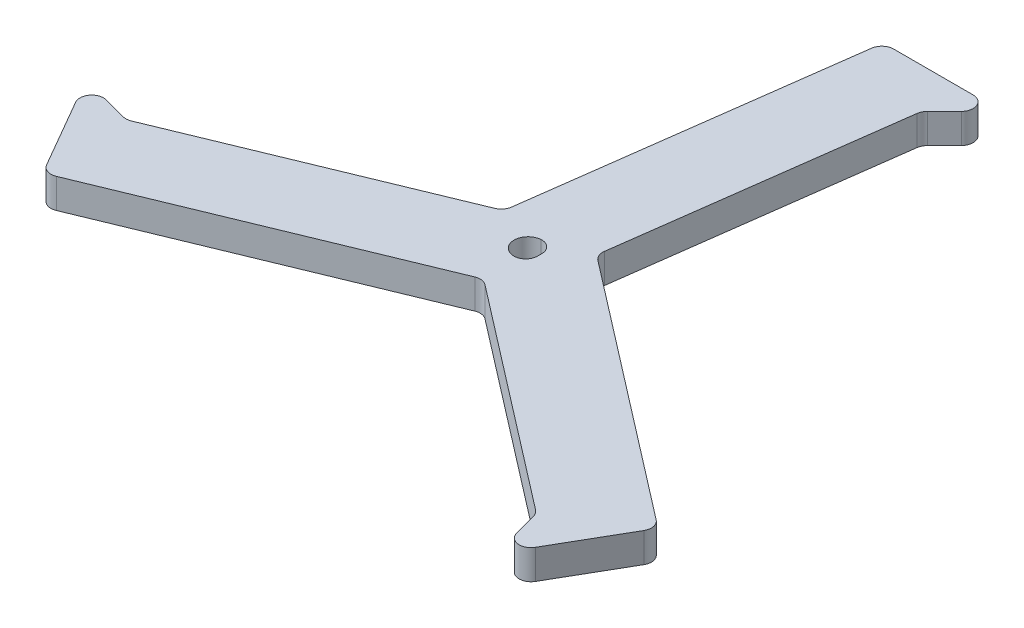
ISO-10303-21;
HEADER;
FILE_DESCRIPTION(('STEP AP214'),'2;1');
FILE_NAME('part.step','',(''),(''),'','','');
FILE_SCHEMA(('AUTOMOTIVE_DESIGN { 1 0 10303 214 1 1 1 1 }'));
ENDSEC;
DATA;
#1=APPLICATION_CONTEXT('core data for automotive mechanical design processes');
#2=APPLICATION_PROTOCOL_DEFINITION('international standard','automotive_design',2000,#1);
#3=PRODUCT_CONTEXT('',#1,'mechanical');
#4=PRODUCT('Part','Part','',(#3));
#5=PRODUCT_RELATED_PRODUCT_CATEGORY('part','',(#4));
#6=PRODUCT_DEFINITION_FORMATION('','',#4);
#7=PRODUCT_DEFINITION_CONTEXT('part definition',#1,'design');
#8=PRODUCT_DEFINITION('design','',#6,#7);
#9=PRODUCT_DEFINITION_SHAPE('','',#8);
#10=(LENGTH_UNIT() NAMED_UNIT(*) SI_UNIT(.MILLI.,.METRE.));
#11=(NAMED_UNIT(*) PLANE_ANGLE_UNIT() SI_UNIT($,.RADIAN.));
#12=(NAMED_UNIT(*) SI_UNIT($,.STERADIAN.) SOLID_ANGLE_UNIT());
#13=UNCERTAINTY_MEASURE_WITH_UNIT(LENGTH_MEASURE(1.E-05),#10,'distance_accuracy_value','');
#14=(GEOMETRIC_REPRESENTATION_CONTEXT(3) GLOBAL_UNCERTAINTY_ASSIGNED_CONTEXT((#13)) GLOBAL_UNIT_ASSIGNED_CONTEXT((#10,
#11,#12)) REPRESENTATION_CONTEXT('',''));
#15=CARTESIAN_POINT('',(0.,0.,0.));
#16=DIRECTION('',(0.,0.,1.));
#17=DIRECTION('',(1.,0.,0.));
#18=AXIS2_PLACEMENT_3D('',#15,#16,#17);
#19=CARTESIAN_POINT('',(3.84359543341386,6.35,9.32960669215885));
#20=DIRECTION('',(0.380918653468894,0.,0.924608554708123));
#21=DIRECTION('',(0.924608554708123,0.,-0.380918653468894));
#22=AXIS2_PLACEMENT_3D('',#19,#20,#21);
#23=PLANE('',#22);
#24=DIRECTION('',(-0.924608554708123,0.,0.380918653468894));
#25=VECTOR('',#24,1.);
#26=CARTESIAN_POINT('',(3.84359543341386,6.35,9.32960669215885));
#27=LINE('',#26,#25);
#28=CARTESIAN_POINT('',(-0.359568594695665,6.35,11.0612190309629));
#29=VERTEX_POINT('',#28);
#30=CARTESIAN_POINT('',(-63.9355147681547,6.35,37.2531287705929));
#31=VERTEX_POINT('',#30);
#32=EDGE_CURVE('E397',#29,#31,#27,.T.);
#33=ORIENTED_EDGE('',*,*,#32,.T.);
#34=DIRECTION('',(0.,-1.,0.));
#35=VECTOR('',#34,1.);
#36=CARTESIAN_POINT('',(-63.9355147681547,6.35,37.2531287705929));
#37=LINE('',#36,#35);
#38=CARTESIAN_POINT('',(-63.9355147681547,0.,37.2531287705929));
#39=VERTEX_POINT('',#38);
#40=EDGE_CURVE('E246',#31,#39,#37,.T.);
#41=ORIENTED_EDGE('',*,*,#40,.T.);
#42=DIRECTION('',(-0.924608554708123,0.,0.380918653468894));
#43=VECTOR('',#42,1.);
#44=CARTESIAN_POINT('',(3.84359543341386,0.,9.32960669215885));
#45=LINE('',#44,#43);
#46=CARTESIAN_POINT('',(-0.359568594695665,0.,11.0612190309629));
#47=VERTEX_POINT('',#46);
#48=EDGE_CURVE('E230',#47,#39,#45,.T.);
#49=ORIENTED_EDGE('',*,*,#48,.F.);
#50=DIRECTION('',(0.,-1.,0.));
#51=VECTOR('',#50,1.);
#52=CARTESIAN_POINT('',(-0.359568594695664,6.35,11.0612190309629));
#53=LINE('',#52,#51);
#54=EDGE_CURVE('E243',#47,#29,#53,.F.);
#55=ORIENTED_EDGE('',*,*,#54,.T.);
#56=EDGE_LOOP('',(#33,#41,#49,#55));
#57=FACE_BOUND('',#56,.T.);
#58=ADVANCED_FACE('F41',(#57),#23,.T.);
#59=CARTESIAN_POINT('',(-4.70645276048368,6.35,6.10937930785126));
#60=DIRECTION('',(-0.610275170199201,0.,0.792189508033485));
#61=DIRECTION('',(0.792189508033486,0.,0.610275170199201));
#62=AXIS2_PLACEMENT_3D('',#59,#60,#61);
#63=PLANE('',#62);
#64=DIRECTION('',(-0.792189508033486,0.,-0.610275170199201));
#65=VECTOR('',#64,1.);
#66=CARTESIAN_POINT('',(-4.70645276048368,0.,6.10937930785126));
#67=LINE('',#66,#65);
#68=CARTESIAN_POINT('',(49.4673189823005,0.,47.8429638042301));
#69=VERTEX_POINT('',#68);
#70=CARTESIAN_POINT('',(2.1580637174213,0.,11.3975634095165));
#71=VERTEX_POINT('',#70);
#72=EDGE_CURVE('E232',#69,#71,#67,.T.);
#73=ORIENTED_EDGE('',*,*,#72,.F.);
#74=DIRECTION('',(0.,-1.,0.));
#75=VECTOR('',#74,1.);
#76=CARTESIAN_POINT('',(49.4673189823005,6.35,47.8429638042301));
#77=LINE('',#76,#75);
#78=CARTESIAN_POINT('',(49.4673189823005,6.35,47.8429638042301));
#79=VERTEX_POINT('',#78);
#80=EDGE_CURVE('E336',#69,#79,#77,.F.);
#81=ORIENTED_EDGE('',*,*,#80,.T.);
#82=DIRECTION('',(-0.792189508033486,0.,-0.610275170199201));
#83=VECTOR('',#82,1.);
#84=CARTESIAN_POINT('',(-4.70645276048368,6.35,6.10937930785126));
#85=LINE('',#84,#83);
#86=CARTESIAN_POINT('',(2.1580637174213,6.35,11.3975634095165));
#87=VERTEX_POINT('',#86);
#88=EDGE_CURVE('E399',#79,#87,#85,.T.);
#89=ORIENTED_EDGE('',*,*,#88,.T.);
#90=DIRECTION('',(0.,-1.,0.));
#91=VECTOR('',#90,1.);
#92=CARTESIAN_POINT('',(2.1580637174213,0.,11.3975634095165));
#93=LINE('',#92,#91);
#94=EDGE_CURVE('E334',#87,#71,#93,.T.);
#95=ORIENTED_EDGE('',*,*,#94,.T.);
#96=EDGE_LOOP('',(#73,#81,#89,#95));
#97=FACE_BOUND('',#96,.T.);
#98=ADVANCED_FACE('F475',(#97),#63,.T.);
#99=CARTESIAN_POINT('',(34.6970452561253,6.35,-9.29704525612464));
#100=DIRECTION('',(-0.96592582628907,0.,0.258819045102514));
#101=DIRECTION('',(0.258819045102514,0.,0.96592582628907));
#102=AXIS2_PLACEMENT_3D('',#99,#100,#101);
#103=PLANE('',#102);
#104=DIRECTION('',(-0.258819045102514,0.,-0.96592582628907));
#105=VECTOR('',#104,1.);
#106=CARTESIAN_POINT('',(34.6970452561253,0.,-9.29704525612464));
#107=LINE('',#106,#105);
#108=CARTESIAN_POINT('',(51.7040308682014,0.,54.173889131738));
#109=VERTEX_POINT('',#108);
#110=CARTESIAN_POINT('',(50.3706716487687,0.,49.1977247800748));
#111=VERTEX_POINT('',#110);
#112=EDGE_CURVE('E432',#109,#111,#107,.T.);
#113=ORIENTED_EDGE('',*,*,#112,.F.);
#114=DIRECTION('',(0.,-1.,0.));
#115=VECTOR('',#114,1.);
#116=CARTESIAN_POINT('',(51.7040308682014,6.35,54.173889131738));
#117=LINE('',#116,#115);
#118=CARTESIAN_POINT('',(51.7040308682014,6.35,54.173889131738));
#119=VERTEX_POINT('',#118);
#120=EDGE_CURVE('E332',#109,#119,#117,.F.);
#121=ORIENTED_EDGE('',*,*,#120,.T.);
#122=DIRECTION('',(-0.258819045102514,0.,-0.96592582628907));
#123=VECTOR('',#122,1.);
#124=CARTESIAN_POINT('',(34.6970452561253,6.35,-9.29704525612464));
#125=LINE('',#124,#123);
#126=CARTESIAN_POINT('',(50.3706716487687,6.35,49.1977247800748));
#127=VERTEX_POINT('',#126);
#128=EDGE_CURVE('E405',#119,#127,#125,.T.);
#129=ORIENTED_EDGE('',*,*,#128,.T.);
#130=DIRECTION('',(0.,-1.,0.));
#131=VECTOR('',#130,1.);
#132=CARTESIAN_POINT('',(50.3706716487687,0.,49.1977247800748));
#133=LINE('',#132,#131);
#134=EDGE_CURVE('E329',#127,#111,#133,.T.);
#135=ORIENTED_EDGE('',*,*,#134,.T.);
#136=EDGE_LOOP('',(#113,#121,#129,#135));
#137=FACE_BOUND('',#136,.T.);
#138=ADVANCED_FACE('F480',(#137),#103,.T.);
#139=CARTESIAN_POINT('',(65.9911357683743,6.35,38.1));
#140=DIRECTION('',(0.866025403784439,0.,0.499999999999999));
#141=DIRECTION('',(0.499999999999999,0.,-0.866025403784439));
#142=AXIS2_PLACEMENT_3D('',#139,#140,#141);
#143=PLANE('',#142);
#144=DIRECTION('',(-0.499999999999999,0.,0.866025403784439));
#145=VECTOR('',#144,1.);
#146=CARTESIAN_POINT('',(65.9911357683743,0.,38.1));
#147=LINE('',#146,#145);
#148=CARTESIAN_POINT('',(64.8795188631703,0.,40.0253769583657));
#149=VERTEX_POINT('',#148);
#150=CARTESIAN_POINT('',(56.3571869925881,0.,54.7864887571776));
#151=VERTEX_POINT('',#150);
#152=EDGE_CURVE('E435',#149,#151,#147,.T.);
#153=ORIENTED_EDGE('',*,*,#152,.F.);
#154=DIRECTION('',(0.,-1.,0.));
#155=VECTOR('',#154,1.);
#156=CARTESIAN_POINT('',(64.8795188631703,6.35,40.0253769583657));
#157=LINE('',#156,#155);
#158=CARTESIAN_POINT('',(64.8795188631703,6.35,40.0253769583657));
#159=VERTEX_POINT('',#158);
#160=EDGE_CURVE('E327',#149,#159,#157,.F.);
#161=ORIENTED_EDGE('',*,*,#160,.T.);
#162=DIRECTION('',(-0.499999999999999,0.,0.866025403784439));
#163=VECTOR('',#162,1.);
#164=CARTESIAN_POINT('',(65.9911357683743,6.35,38.1));
#165=LINE('',#164,#163);
#166=CARTESIAN_POINT('',(56.3571869925881,6.35,54.7864887571776));
#167=VERTEX_POINT('',#166);
#168=EDGE_CURVE('E408',#159,#167,#165,.T.);
#169=ORIENTED_EDGE('',*,*,#168,.T.);
#170=DIRECTION('',(0.,-1.,0.));
#171=VECTOR('',#170,1.);
#172=CARTESIAN_POINT('',(56.3571869925881,6.35,54.7864887571776));
#173=LINE('',#172,#171);
#174=EDGE_CURVE('E324',#167,#151,#173,.T.);
#175=ORIENTED_EDGE('',*,*,#174,.T.);
#176=EDGE_LOOP('',(#153,#161,#169,#175));
#177=FACE_BOUND('',#176,.T.);
#178=ADVANCED_FACE('F693',(#177),#143,.T.);
#179=CARTESIAN_POINT('',(6.15787868601994,6.35,-7.99345463328569));
#180=DIRECTION('',(0.610275170199202,0.,-0.792189508033485));
#181=DIRECTION('',(-0.792189508033486,0.,-0.610275170199202));
#182=AXIS2_PLACEMENT_3D('',#179,#180,#181);
#183=PLANE('',#182);
#184=DIRECTION('',(0.792189508033485,0.,0.610275170199202));
#185=VECTOR('',#184,1.);
#186=CARTESIAN_POINT('',(6.15787868601994,0.,-7.99345463328569));
#187=LINE('',#186,#185);
#188=CARTESIAN_POINT('',(9.7590809749856,0.,-5.21921397807195));
#189=VERTEX_POINT('',#188);
#190=CARTESIAN_POINT('',(64.2299132698638,0.,36.7432156079607));
#191=VERTEX_POINT('',#190);
#192=EDGE_CURVE('E438',#189,#191,#187,.T.);
#193=ORIENTED_EDGE('',*,*,#192,.F.);
#194=DIRECTION('',(0.,-1.,0.));
#195=VECTOR('',#194,1.);
#196=CARTESIAN_POINT('',(9.7590809749856,6.35,-5.21921397807195));
#197=LINE('',#196,#195);
#198=CARTESIAN_POINT('',(9.7590809749856,6.35,-5.21921397807195));
#199=VERTEX_POINT('',#198);
#200=EDGE_CURVE('E322',#189,#199,#197,.F.);
#201=ORIENTED_EDGE('',*,*,#200,.T.);
#202=DIRECTION('',(0.792189508033485,0.,0.610275170199202));
#203=VECTOR('',#202,1.);
#204=CARTESIAN_POINT('',(6.15787868601994,6.35,-7.99345463328569));
#205=LINE('',#204,#203);
#206=CARTESIAN_POINT('',(64.2299132698638,6.35,36.7432156079607));
#207=VERTEX_POINT('',#206);
#208=EDGE_CURVE('E411',#199,#207,#205,.T.);
#209=ORIENTED_EDGE('',*,*,#208,.T.);
#210=DIRECTION('',(0.,-1.,0.));
#211=VECTOR('',#210,1.);
#212=CARTESIAN_POINT('',(64.2299132698638,6.35,36.7432156079607));
#213=LINE('',#212,#211);
#214=EDGE_CURVE('E319',#207,#191,#213,.T.);
#215=ORIENTED_EDGE('',*,*,#214,.T.);
#216=EDGE_LOOP('',(#193,#201,#209,#215));
#217=FACE_BOUND('',#216,.T.);
#218=ADVANCED_FACE('F684',(#217),#183,.T.);
#219=CARTESIAN_POINT('',(7.644104062196,6.35,1.02121799836464));
#220=DIRECTION('',(0.991193823668096,0.,0.132419046674638));
#221=DIRECTION('',(0.132419046674638,0.,-0.991193823668096));
#222=AXIS2_PLACEMENT_3D('',#219,#220,#221);
#223=PLANE('',#222);
#224=DIRECTION('',(-0.132419046674638,0.,0.991193823668096));
#225=VECTOR('',#224,1.);
#226=CARTESIAN_POINT('',(7.644104062196,0.,1.02121799836464));
#227=LINE('',#226,#225);
#228=CARTESIAN_POINT('',(16.6995625556525,0.,-66.7614367978954));
#229=VERTEX_POINT('',#228);
#230=CARTESIAN_POINT('',(8.7915475951746,0.,-7.56771970703058));
#231=VERTEX_POINT('',#230);
#232=EDGE_CURVE('E441',#229,#231,#227,.T.);
#233=ORIENTED_EDGE('',*,*,#232,.F.);
#234=DIRECTION('',(0.,-1.,0.));
#235=VECTOR('',#234,1.);
#236=CARTESIAN_POINT('',(16.6995625556525,6.35,-66.7614367978954));
#237=LINE('',#236,#235);
#238=CARTESIAN_POINT('',(16.6995625556525,6.35,-66.7614367978954));
#239=VERTEX_POINT('',#238);
#240=EDGE_CURVE('E317',#229,#239,#237,.F.);
#241=ORIENTED_EDGE('',*,*,#240,.T.);
#242=DIRECTION('',(-0.132419046674638,0.,0.991193823668096));
#243=VECTOR('',#242,1.);
#244=CARTESIAN_POINT('',(7.644104062196,6.35,1.02121799836464));
#245=LINE('',#244,#243);
#246=CARTESIAN_POINT('',(8.7915475951746,6.35,-7.56771970703058));
#247=VERTEX_POINT('',#246);
#248=EDGE_CURVE('E414',#239,#247,#245,.T.);
#249=ORIENTED_EDGE('',*,*,#248,.T.);
#250=DIRECTION('',(0.,-1.,0.));
#251=VECTOR('',#250,1.);
#252=CARTESIAN_POINT('',(8.7915475951746,0.,-7.56771970703058));
#253=LINE('',#252,#251);
#254=EDGE_CURVE('E314',#247,#231,#253,.T.);
#255=ORIENTED_EDGE('',*,*,#254,.T.);
#256=EDGE_LOOP('',(#233,#241,#249,#255));
#257=FACE_BOUND('',#256,.T.);
#258=ADVANCED_FACE('F675',(#257),#223,.T.);
#259=CARTESIAN_POINT('',(-25.4000000000001,6.35,-25.4000000000004));
#260=DIRECTION('',(0.707106781186544,0.,0.707106781186551));
#261=DIRECTION('',(0.707106781186551,0.,-0.707106781186544));
#262=AXIS2_PLACEMENT_3D('',#259,#260,#261);
#263=PLANE('',#262);
#264=DIRECTION('',(-0.707106781186551,0.,0.707106781186544));
#265=VECTOR('',#264,1.);
#266=CARTESIAN_POINT('',(-25.4000000000001,0.,-25.4000000000004));
#267=LINE('',#266,#265);
#268=CARTESIAN_POINT('',(21.0639487757861,0.,-71.8639487757862));
#269=VERTEX_POINT('',#268);
#270=CARTESIAN_POINT('',(17.4211436435556,0.,-68.2211436435557));
#271=VERTEX_POINT('',#270);
#272=EDGE_CURVE('E444',#269,#271,#267,.T.);
#273=ORIENTED_EDGE('',*,*,#272,.F.);
#274=DIRECTION('',(0.,-1.,0.));
#275=VECTOR('',#274,1.);
#276=CARTESIAN_POINT('',(21.0639487757861,6.35,-71.8639487757862));
#277=LINE('',#276,#275);
#278=CARTESIAN_POINT('',(21.0639487757861,6.35,-71.8639487757862));
#279=VERTEX_POINT('',#278);
#280=EDGE_CURVE('E312',#269,#279,#277,.F.);
#281=ORIENTED_EDGE('',*,*,#280,.T.);
#282=DIRECTION('',(-0.707106781186551,0.,0.707106781186544));
#283=VECTOR('',#282,1.);
#284=CARTESIAN_POINT('',(-25.4000000000001,6.35,-25.4000000000004));
#285=LINE('',#284,#283);
#286=CARTESIAN_POINT('',(17.4211436435556,6.35,-68.2211436435557));
#287=VERTEX_POINT('',#286);
#288=EDGE_CURVE('E417',#279,#287,#285,.T.);
#289=ORIENTED_EDGE('',*,*,#288,.T.);
#290=DIRECTION('',(0.,-1.,0.));
#291=VECTOR('',#290,1.);
#292=CARTESIAN_POINT('',(17.4211436435556,0.,-68.2211436435557));
#293=LINE('',#292,#291);
#294=EDGE_CURVE('E309',#287,#271,#293,.T.);
#295=ORIENTED_EDGE('',*,*,#294,.T.);
#296=EDGE_LOOP('',(#273,#281,#289,#295));
#297=FACE_BOUND('',#296,.T.);
#298=ADVANCED_FACE('F666',(#297),#263,.T.);
#299=CARTESIAN_POINT('',(0.,6.35,-76.2));
#300=DIRECTION('',(0.,0.,-1.));
#301=DIRECTION('',(-1.,0.,0.));
#302=AXIS2_PLACEMENT_3D('',#299,#300,#301);
#303=PLANE('',#302);
#304=DIRECTION('',(1.,0.,0.));
#305=VECTOR('',#304,1.);
#306=CARTESIAN_POINT('',(0.,0.,-76.2));
#307=LINE('',#306,#305);
#308=CARTESIAN_POINT('',(2.22323381040792,0.,-76.2));
#309=VERTEX_POINT('',#308);
#310=CARTESIAN_POINT('',(19.2678975515723,0.,-76.2));
#311=VERTEX_POINT('',#310);
#312=EDGE_CURVE('E447',#309,#311,#307,.T.);
#313=ORIENTED_EDGE('',*,*,#312,.F.);
#314=DIRECTION('',(0.,-1.,0.));
#315=VECTOR('',#314,1.);
#316=CARTESIAN_POINT('',(2.22323381040792,6.35,-76.2));
#317=LINE('',#316,#315);
#318=CARTESIAN_POINT('',(2.22323381040792,6.35,-76.2));
#319=VERTEX_POINT('',#318);
#320=EDGE_CURVE('E307',#309,#319,#317,.F.);
#321=ORIENTED_EDGE('',*,*,#320,.T.);
#322=DIRECTION('',(1.,0.,0.));
#323=VECTOR('',#322,1.);
#324=CARTESIAN_POINT('',(0.,6.35,-76.2));
#325=LINE('',#324,#323);
#326=CARTESIAN_POINT('',(19.2678975515723,6.35,-76.2));
#327=VERTEX_POINT('',#326);
#328=EDGE_CURVE('E420',#319,#327,#325,.T.);
#329=ORIENTED_EDGE('',*,*,#328,.T.);
#330=DIRECTION('',(0.,-1.,0.));
#331=VECTOR('',#330,1.);
#332=CARTESIAN_POINT('',(19.2678975515723,6.35,-76.2));
#333=LINE('',#332,#331);
#334=EDGE_CURVE('E304',#327,#311,#333,.T.);
#335=ORIENTED_EDGE('',*,*,#334,.T.);
#336=EDGE_LOOP('',(#313,#321,#329,#335));
#337=FACE_BOUND('',#336,.T.);
#338=ADVANCED_FACE('F657',(#337),#303,.T.);
#339=CARTESIAN_POINT('',(-10.0014741194338,6.35,-1.33615205887316));
#340=DIRECTION('',(-0.991193823668096,0.,-0.132419046674638));
#341=DIRECTION('',(-0.132419046674638,0.,0.991193823668096));
#342=AXIS2_PLACEMENT_3D('',#339,#340,#341);
#343=PLANE('',#342);
#344=DIRECTION('',(0.132419046674638,0.,-0.991193823668096));
#345=VECTOR('',#344,1.);
#346=CARTESIAN_POINT('',(-10.0014741194338,0.,-1.33615205887316));
#347=LINE('',#346,#345);
#348=CARTESIAN_POINT('',(-9.39951238028993,0.,-5.84200505289098));
#349=VERTEX_POINT('',#348);
#350=CARTESIAN_POINT('',(-0.294398501709038,0.,-73.9963443785536));
#351=VERTEX_POINT('',#350);
#352=EDGE_CURVE('E450',#349,#351,#347,.T.);
#353=ORIENTED_EDGE('',*,*,#352,.F.);
#354=DIRECTION('',(0.,-1.,0.));
#355=VECTOR('',#354,1.);
#356=CARTESIAN_POINT('',(-9.39951238028993,6.35,-5.84200505289098));
#357=LINE('',#356,#355);
#358=CARTESIAN_POINT('',(-9.39951238028993,6.35,-5.84200505289098));
#359=VERTEX_POINT('',#358);
#360=EDGE_CURVE('E302',#349,#359,#357,.F.);
#361=ORIENTED_EDGE('',*,*,#360,.T.);
#362=DIRECTION('',(0.132419046674638,0.,-0.991193823668096));
#363=VECTOR('',#362,1.);
#364=CARTESIAN_POINT('',(-10.0014741194338,6.35,-1.33615205887316));
#365=LINE('',#364,#363);
#366=CARTESIAN_POINT('',(-0.294398501709038,6.35,-73.9963443785536));
#367=VERTEX_POINT('',#366);
#368=EDGE_CURVE('E423',#359,#367,#365,.T.);
#369=ORIENTED_EDGE('',*,*,#368,.T.);
#370=DIRECTION('',(0.,-1.,0.));
#371=VECTOR('',#370,1.);
#372=CARTESIAN_POINT('',(-0.294398501709038,6.35,-73.9963443785536));
#373=LINE('',#372,#371);
#374=EDGE_CURVE('E299',#367,#351,#373,.T.);
#375=ORIENTED_EDGE('',*,*,#374,.T.);
#376=EDGE_LOOP('',(#353,#361,#369,#375));
#377=FACE_BOUND('',#376,.T.);
#378=ADVANCED_FACE('F648',(#377),#343,.T.);
#379=CARTESIAN_POINT('',(-2.93765130171234,6.35,-7.1305973062159));
#380=DIRECTION('',(-0.380918653468895,0.,-0.924608554708123));
#381=DIRECTION('',(-0.924608554708123,0.,0.380918653468895));
#382=AXIS2_PLACEMENT_3D('',#379,#380,#381);
#383=PLANE('',#382);
#384=DIRECTION('',(0.924608554708123,0.,-0.380918653468895));
#385=VECTOR('',#384,1.);
#386=CARTESIAN_POINT('',(-2.93765130171234,0.,-7.1305973062159));
#387=LINE('',#386,#385);
#388=CARTESIAN_POINT('',(-66.166881537953,0.,18.9184729936653));
#389=VERTEX_POINT('',#388);
#390=CARTESIAN_POINT('',(-10.9496113125959,0.,-3.82984370248593));
#391=VERTEX_POINT('',#390);
#392=EDGE_CURVE('E453',#389,#391,#387,.T.);
#393=ORIENTED_EDGE('',*,*,#392,.F.);
#394=DIRECTION('',(0.,-1.,0.));
#395=VECTOR('',#394,1.);
#396=CARTESIAN_POINT('',(-66.1668815379529,6.35,18.9184729936653));
#397=LINE('',#396,#395);
#398=CARTESIAN_POINT('',(-66.166881537953,6.35,18.9184729936653));
#399=VERTEX_POINT('',#398);
#400=EDGE_CURVE('E297',#389,#399,#397,.F.);
#401=ORIENTED_EDGE('',*,*,#400,.T.);
#402=DIRECTION('',(0.924608554708123,0.,-0.380918653468895));
#403=VECTOR('',#402,1.);
#404=CARTESIAN_POINT('',(-2.93765130171234,6.35,-7.1305973062159));
#405=LINE('',#404,#403);
#406=CARTESIAN_POINT('',(-10.9496113125959,6.35,-3.82984370248593));
#407=VERTEX_POINT('',#406);
#408=EDGE_CURVE('E426',#399,#407,#405,.T.);
#409=ORIENTED_EDGE('',*,*,#408,.T.);
#410=DIRECTION('',(0.,-1.,0.));
#411=VECTOR('',#410,1.);
#412=CARTESIAN_POINT('',(-10.9496113125959,0.,-3.82984370248593));
#413=LINE('',#412,#411);
#414=EDGE_CURVE('E294',#407,#391,#413,.T.);
#415=ORIENTED_EDGE('',*,*,#414,.T.);
#416=EDGE_LOOP('',(#393,#401,#409,#415));
#417=FACE_BOUND('',#416,.T.);
#418=ADVANCED_FACE('F640',(#417),#383,.T.);
#419=CARTESIAN_POINT('',(-9.29704525612504,6.35,34.6970452561251));
#420=DIRECTION('',(0.258819045102526,0.,-0.965925826289067));
#421=DIRECTION('',(-0.965925826289067,0.,-0.258819045102526));
#422=AXIS2_PLACEMENT_3D('',#419,#420,#421);
#423=PLANE('',#422);
#424=DIRECTION('',(0.965925826289067,0.,0.258819045102526));
#425=VECTOR('',#424,1.);
#426=CARTESIAN_POINT('',(-9.29704525612504,6.35,34.6970452561251));
#427=LINE('',#426,#425);
#428=CARTESIAN_POINT('',(-72.7679796439875,6.35,17.6900596440482));
#429=VERTEX_POINT('',#428);
#430=CARTESIAN_POINT('',(-67.7918152923243,6.35,19.0234188634809));
#431=VERTEX_POINT('',#430);
#432=EDGE_CURVE('E256',#429,#431,#427,.T.);
#433=ORIENTED_EDGE('',*,*,#432,.T.);
#434=DIRECTION('',(0.,-1.,0.));
#435=VECTOR('',#434,1.);
#436=CARTESIAN_POINT('',(-67.7918152923243,0.,19.0234188634809));
#437=LINE('',#436,#435);
#438=CARTESIAN_POINT('',(-67.7918152923243,0.,19.0234188634809));
#439=VERTEX_POINT('',#438);
#440=EDGE_CURVE('E291',#431,#439,#437,.T.);
#441=ORIENTED_EDGE('',*,*,#440,.T.);
#442=DIRECTION('',(0.965925826289067,0.,0.258819045102526));
#443=VECTOR('',#442,1.);
#444=CARTESIAN_POINT('',(-9.29704525612504,0.,34.6970452561251));
#445=LINE('',#444,#443);
#446=CARTESIAN_POINT('',(-72.7679796439875,0.,17.6900596440482));
#447=VERTEX_POINT('',#446);
#448=EDGE_CURVE('E455',#447,#439,#445,.T.);
#449=ORIENTED_EDGE('',*,*,#448,.F.);
#450=DIRECTION('',(0.,-1.,0.));
#451=VECTOR('',#450,1.);
#452=CARTESIAN_POINT('',(-72.7679796439875,6.35,17.6900596440482));
#453=LINE('',#452,#451);
#454=EDGE_CURVE('E63',#447,#429,#453,.F.);
#455=ORIENTED_EDGE('',*,*,#454,.T.);
#456=EDGE_LOOP('',(#433,#441,#449,#455));
#457=FACE_BOUND('',#456,.T.);
#458=ADVANCED_FACE('F489',(#457),#423,.T.);
#459=CARTESIAN_POINT('',(0.,6.35,0.));
#460=DIRECTION('',(0.,-1.,0.));
#461=DIRECTION('',(0.,0.,-1.));
#462=AXIS2_PLACEMENT_3D('',#459,#460,#461);
#463=CYLINDRICAL_SURFACE('',#462,2.999994);
#464=CARTESIAN_POINT('',(0.,6.35,0.));
#465=DIRECTION('',(0.,1.,0.));
#466=DIRECTION('',(0.,0.,1.));
#467=AXIS2_PLACEMENT_3D('',#464,#465,#466);
#468=CIRCLE('',#467,2.999994);
#469=CARTESIAN_POINT('',(-0.260911577029271,6.35,-2.98862663258696));
#470=VERTEX_POINT('',#469);
#471=CARTESIAN_POINT('',(-0.260911577029271,6.35,2.98862663258696));
#472=VERTEX_POINT('',#471);
#473=EDGE_CURVE('E393',#470,#472,#468,.T.);
#474=ORIENTED_EDGE('',*,*,#473,.T.);
#475=DIRECTION('',(0.,-1.,0.));
#476=VECTOR('',#475,1.);
#477=CARTESIAN_POINT('',(-0.260911577029271,6.35,2.98862663258696));
#478=LINE('',#477,#476);
#479=CARTESIAN_POINT('',(-0.260911577029271,0.,2.98862663258696));
#480=VERTEX_POINT('',#479);
#481=EDGE_CURVE('E340',#472,#480,#478,.T.);
#482=ORIENTED_EDGE('',*,*,#481,.T.);
#483=CARTESIAN_POINT('',(0.,0.,0.));
#484=DIRECTION('',(0.,1.,0.));
#485=DIRECTION('',(0.,0.,1.));
#486=AXIS2_PLACEMENT_3D('',#483,#484,#485);
#487=CIRCLE('',#486,2.999994);
#488=CARTESIAN_POINT('',(-0.260911577029271,0.,-2.98862663258696));
#489=VERTEX_POINT('',#488);
#490=EDGE_CURVE('E374',#489,#480,#487,.T.);
#491=ORIENTED_EDGE('',*,*,#490,.F.);
#492=DIRECTION('',(0.,-1.,0.));
#493=VECTOR('',#492,1.);
#494=CARTESIAN_POINT('',(-0.260911577029271,6.35,-2.98862663258696));
#495=LINE('',#494,#493);
#496=EDGE_CURVE('E338',#489,#470,#495,.F.);
#497=ORIENTED_EDGE('',*,*,#496,.T.);
#498=EDGE_LOOP('',(#474,#482,#491,#497));
#499=FACE_BOUND('',#498,.T.);
#500=ADVANCED_FACE('F381',(#499),#463,.F.);
#501=CARTESIAN_POINT('',(2.499994,6.35,0.));
#502=DIRECTION('',(1.,0.,0.));
#503=DIRECTION('',(0.,0.,-1.));
#504=AXIS2_PLACEMENT_3D('',#501,#502,#503);
#505=PLANE('',#504);
#506=DIRECTION('',(0.,0.,1.));
#507=VECTOR('',#506,1.);
#508=CARTESIAN_POINT('',(2.499994,0.,0.));
#509=LINE('',#508,#507);
#510=CARTESIAN_POINT('',(2.499994,0.,-0.458251022912115));
#511=VERTEX_POINT('',#510);
#512=CARTESIAN_POINT('',(2.499994,0.,0.458251022912115));
#513=VERTEX_POINT('',#512);
#514=EDGE_CURVE('E247',#511,#513,#509,.T.);
#515=ORIENTED_EDGE('',*,*,#514,.T.);
#516=DIRECTION('',(0.,-1.,0.));
#517=VECTOR('',#516,1.);
#518=CARTESIAN_POINT('',(2.499994,6.35,0.458251022912115));
#519=LINE('',#518,#517);
#520=CARTESIAN_POINT('',(2.499994,6.35,0.458251022912115));
#521=VERTEX_POINT('',#520);
#522=EDGE_CURVE('E346',#513,#521,#519,.F.);
#523=ORIENTED_EDGE('',*,*,#522,.T.);
#524=DIRECTION('',(0.,0.,1.));
#525=VECTOR('',#524,1.);
#526=CARTESIAN_POINT('',(2.499994,6.35,0.));
#527=LINE('',#526,#525);
#528=CARTESIAN_POINT('',(2.499994,6.35,-0.458251022912115));
#529=VERTEX_POINT('',#528);
#530=EDGE_CURVE('E391',#529,#521,#527,.T.);
#531=ORIENTED_EDGE('',*,*,#530,.F.);
#532=DIRECTION('',(0.,-1.,0.));
#533=VECTOR('',#532,1.);
#534=CARTESIAN_POINT('',(2.499994,6.35,-0.458251022912115));
#535=LINE('',#534,#533);
#536=EDGE_CURVE('E343',#529,#511,#535,.T.);
#537=ORIENTED_EDGE('',*,*,#536,.T.);
#538=EDGE_LOOP('',(#515,#523,#531,#537));
#539=FACE_BOUND('',#538,.T.);
#540=ADVANCED_FACE('F395',(#539),#505,.F.);
#541=CARTESIAN_POINT('',(-65.9911357683742,6.35,38.1000000000001));
#542=DIRECTION('',(-0.866025403784438,0.,0.500000000000001));
#543=DIRECTION('',(0.500000000000001,0.,0.866025403784438));
#544=AXIS2_PLACEMENT_3D('',#541,#542,#543);
#545=PLANE('',#544);
#546=DIRECTION('',(-0.500000000000001,0.,-0.866025403784438));
#547=VECTOR('',#546,1.);
#548=CARTESIAN_POINT('',(-65.9911357683742,0.,38.1000000000001));
#549=LINE('',#548,#547);
#550=CARTESIAN_POINT('',(-67.1027526735782,0.,36.1746230416343));
#551=VERTEX_POINT('',#550);
#552=CARTESIAN_POINT('',(-75.6250845441604,0.,21.4135112428224));
#553=VERTEX_POINT('',#552);
#554=EDGE_CURVE('E259',#551,#553,#549,.T.);
#555=ORIENTED_EDGE('',*,*,#554,.F.);
#556=DIRECTION('',(0.,-1.,0.));
#557=VECTOR('',#556,1.);
#558=CARTESIAN_POINT('',(-67.1027526735782,6.35,36.1746230416343));
#559=LINE('',#558,#557);
#560=CARTESIAN_POINT('',(-67.1027526735782,6.35,36.1746230416343));
#561=VERTEX_POINT('',#560);
#562=EDGE_CURVE('E276',#551,#561,#559,.F.);
#563=ORIENTED_EDGE('',*,*,#562,.T.);
#564=DIRECTION('',(-0.500000000000001,0.,-0.866025403784438));
#565=VECTOR('',#564,1.);
#566=CARTESIAN_POINT('',(-65.9911357683742,6.35,38.1000000000001));
#567=LINE('',#566,#565);
#568=CARTESIAN_POINT('',(-75.6250845441604,6.35,21.4135112428224));
#569=VERTEX_POINT('',#568);
#570=EDGE_CURVE('E251',#561,#569,#567,.T.);
#571=ORIENTED_EDGE('',*,*,#570,.T.);
#572=DIRECTION('',(0.,-1.,0.));
#573=VECTOR('',#572,1.);
#574=CARTESIAN_POINT('',(-75.6250845441604,6.35,21.4135112428224));
#575=LINE('',#574,#573);
#576=EDGE_CURVE('E273',#569,#553,#575,.T.);
#577=ORIENTED_EDGE('',*,*,#576,.T.);
#578=EDGE_LOOP('',(#555,#563,#571,#577));
#579=FACE_BOUND('',#578,.T.);
#580=ADVANCED_FACE('F461',(#579),#545,.T.);
#581=CARTESIAN_POINT('',(0.,6.35,0.));
#582=DIRECTION('',(0.,1.,0.));
#583=DIRECTION('',(0.,0.,1.));
#584=AXIS2_PLACEMENT_3D('',#581,#582,#583);
#585=PLANE('',#584);
#586=ORIENTED_EDGE('',*,*,#473,.F.);
#587=CARTESIAN_POINT('',(-0.0400060000000008,6.35,-0.458251022912115));
#588=DIRECTION('',(0.,1.,0.));
#589=DIRECTION('',(0.,0.,1.));
#590=AXIS2_PLACEMENT_3D('',#587,#588,#589);
#591=CIRCLE('',#590,2.54);
#592=EDGE_CURVE('E11',#470,#529,#591,.F.);
#593=ORIENTED_EDGE('',*,*,#592,.T.);
#594=ORIENTED_EDGE('',*,*,#530,.T.);
#595=CARTESIAN_POINT('',(-0.0400060000000008,6.35,0.458251022912115));
#596=DIRECTION('',(0.,1.,0.));
#597=DIRECTION('',(0.,0.,1.));
#598=AXIS2_PLACEMENT_3D('',#595,#596,#597);
#599=CIRCLE('',#598,2.54);
#600=EDGE_CURVE('E369',#521,#472,#599,.F.);
#601=ORIENTED_EDGE('',*,*,#600,.T.);
#602=EDGE_LOOP('',(#586,#593,#594,#601));
#603=FACE_BOUND('',#602,.T.);
#604=ORIENTED_EDGE('',*,*,#570,.F.);
#605=CARTESIAN_POINT('',(-64.9030481479657,6.35,34.9046230416343));
#606=DIRECTION('',(0.,1.,0.));
#607=DIRECTION('',(0.,0.,1.));
#608=AXIS2_PLACEMENT_3D('',#605,#606,#607);
#609=CIRCLE('',#608,2.54);
#610=EDGE_CURVE('E288',#561,#31,#609,.T.);
#611=ORIENTED_EDGE('',*,*,#610,.T.);
#612=ORIENTED_EDGE('',*,*,#32,.F.);
#613=CARTESIAN_POINT('',(0.607964785115327,6.35,13.4097247599215));
#614=DIRECTION('',(0.,1.,0.));
#615=DIRECTION('',(0.,0.,1.));
#616=AXIS2_PLACEMENT_3D('',#613,#614,#615);
#617=CIRCLE('',#616,2.54);
#618=EDGE_CURVE('E237',#29,#87,#617,.F.);
#619=ORIENTED_EDGE('',*,*,#618,.T.);
#620=ORIENTED_EDGE('',*,*,#88,.F.);
#621=CARTESIAN_POINT('',(47.9172200499945,6.35,49.8551251546352));
#622=DIRECTION('',(0.,1.,0.));
#623=DIRECTION('',(0.,0.,1.));
#624=AXIS2_PLACEMENT_3D('',#621,#622,#623);
#625=CIRCLE('',#624,2.54);
#626=EDGE_CURVE('E238',#79,#127,#625,.F.);
#627=ORIENTED_EDGE('',*,*,#626,.T.);
#628=ORIENTED_EDGE('',*,*,#128,.F.);
#629=CARTESIAN_POINT('',(54.1574824669756,6.35,53.5164887571776));
#630=DIRECTION('',(0.,1.,0.));
#631=DIRECTION('',(0.,0.,1.));
#632=AXIS2_PLACEMENT_3D('',#629,#630,#631);
#633=CIRCLE('',#632,2.54);
#634=EDGE_CURVE('E280',#119,#167,#633,.T.);
#635=ORIENTED_EDGE('',*,*,#634,.T.);
#636=ORIENTED_EDGE('',*,*,#168,.F.);
#637=CARTESIAN_POINT('',(62.6798143375578,6.35,38.7553769583657));
#638=DIRECTION('',(0.,1.,0.));
#639=DIRECTION('',(0.,0.,1.));
#640=AXIS2_PLACEMENT_3D('',#637,#638,#639);
#641=CIRCLE('',#640,2.54);
#642=EDGE_CURVE('E282',#159,#207,#641,.T.);
#643=ORIENTED_EDGE('',*,*,#642,.T.);
#644=ORIENTED_EDGE('',*,*,#208,.F.);
#645=CARTESIAN_POINT('',(11.3091799072916,6.35,-7.231375328477));
#646=DIRECTION('',(0.,1.,0.));
#647=DIRECTION('',(0.,0.,1.));
#648=AXIS2_PLACEMENT_3D('',#645,#646,#647);
#649=CIRCLE('',#648,2.54);
#650=EDGE_CURVE('E361',#199,#247,#649,.F.);
#651=ORIENTED_EDGE('',*,*,#650,.T.);
#652=ORIENTED_EDGE('',*,*,#248,.F.);
#653=CARTESIAN_POINT('',(19.2171948677694,6.35,-66.4250924193419));
#654=DIRECTION('',(0.,1.,0.));
#655=DIRECTION('',(0.,0.,1.));
#656=AXIS2_PLACEMENT_3D('',#653,#654,#655);
#657=CIRCLE('',#656,2.54);
#658=EDGE_CURVE('E357',#239,#287,#657,.F.);
#659=ORIENTED_EDGE('',*,*,#658,.T.);
#660=ORIENTED_EDGE('',*,*,#288,.F.);
#661=CARTESIAN_POINT('',(19.2678975515723,6.35,-73.66));
#662=DIRECTION('',(0.,1.,0.));
#663=DIRECTION('',(0.,0.,1.));
#664=AXIS2_PLACEMENT_3D('',#661,#662,#663);
#665=CIRCLE('',#664,2.54);
#666=EDGE_CURVE('E284',#279,#327,#665,.T.);
#667=ORIENTED_EDGE('',*,*,#666,.T.);
#668=ORIENTED_EDGE('',*,*,#328,.F.);
#669=CARTESIAN_POINT('',(2.22323381040792,6.35,-73.66));
#670=DIRECTION('',(0.,1.,0.));
#671=DIRECTION('',(0.,0.,1.));
#672=AXIS2_PLACEMENT_3D('',#669,#670,#671);
#673=CIRCLE('',#672,2.54);
#674=EDGE_CURVE('E286',#319,#367,#673,.T.);
#675=ORIENTED_EDGE('',*,*,#674,.T.);
#676=ORIENTED_EDGE('',*,*,#368,.F.);
#677=CARTESIAN_POINT('',(-11.9171446924069,6.35,-6.17834943144456));
#678=DIRECTION('',(0.,1.,0.));
#679=DIRECTION('',(0.,0.,1.));
#680=AXIS2_PLACEMENT_3D('',#677,#678,#679);
#681=CIRCLE('',#680,2.54);
#682=EDGE_CURVE('E353',#359,#407,#681,.F.);
#683=ORIENTED_EDGE('',*,*,#682,.T.);
#684=ORIENTED_EDGE('',*,*,#408,.F.);
#685=CARTESIAN_POINT('',(-67.1344149177639,6.35,16.5699672647067));
#686=DIRECTION('',(0.,1.,0.));
#687=DIRECTION('',(0.,0.,1.));
#688=AXIS2_PLACEMENT_3D('',#685,#686,#687);
#689=CIRCLE('',#688,2.54);
#690=EDGE_CURVE('E56',#399,#431,#689,.F.);
#691=ORIENTED_EDGE('',*,*,#690,.T.);
#692=ORIENTED_EDGE('',*,*,#432,.F.);
#693=CARTESIAN_POINT('',(-73.4253800185479,6.35,20.1435112428224));
#694=DIRECTION('',(0.,1.,0.));
#695=DIRECTION('',(0.,0.,1.));
#696=AXIS2_PLACEMENT_3D('',#693,#694,#695);
#697=CIRCLE('',#696,2.54);
#698=EDGE_CURVE('E278',#429,#569,#697,.T.);
#699=ORIENTED_EDGE('',*,*,#698,.T.);
#700=EDGE_LOOP('',(#604,#611,#612,#619,#620,#627,#628,#635,#636,#643,#644,#651,#652,#659,#660,
#667,#668,#675,#676,#683,#684,#691,#692,#699));
#701=FACE_BOUND('',#700,.T.);
#702=ADVANCED_FACE('F390',(#603,#701),#585,.T.);
#703=CARTESIAN_POINT('',(0.,0.,0.));
#704=DIRECTION('',(0.,1.,0.));
#705=DIRECTION('',(0.,0.,1.));
#706=AXIS2_PLACEMENT_3D('',#703,#704,#705);
#707=PLANE('',#706);
#708=ORIENTED_EDGE('',*,*,#514,.F.);
#709=CARTESIAN_POINT('',(-0.0400060000000008,0.,-0.458251022912115));
#710=DIRECTION('',(0.,1.,0.));
#711=DIRECTION('',(0.,0.,1.));
#712=AXIS2_PLACEMENT_3D('',#709,#710,#711);
#713=CIRCLE('',#712,2.54);
#714=EDGE_CURVE('E49',#511,#489,#713,.T.);
#715=ORIENTED_EDGE('',*,*,#714,.T.);
#716=ORIENTED_EDGE('',*,*,#490,.T.);
#717=CARTESIAN_POINT('',(-0.0400060000000008,0.,0.458251022912115));
#718=DIRECTION('',(0.,1.,0.));
#719=DIRECTION('',(0.,0.,1.));
#720=AXIS2_PLACEMENT_3D('',#717,#718,#719);
#721=CIRCLE('',#720,2.54);
#722=EDGE_CURVE('E367',#480,#513,#721,.T.);
#723=ORIENTED_EDGE('',*,*,#722,.T.);
#724=EDGE_LOOP('',(#708,#715,#716,#723));
#725=FACE_BOUND('',#724,.T.);
#726=ORIENTED_EDGE('',*,*,#48,.T.);
#727=CARTESIAN_POINT('',(-64.9030481479657,0.,34.9046230416343));
#728=DIRECTION('',(0.,1.,0.));
#729=DIRECTION('',(0.,0.,1.));
#730=AXIS2_PLACEMENT_3D('',#727,#728,#729);
#731=CIRCLE('',#730,2.54);
#732=EDGE_CURVE('E271',#39,#551,#731,.F.);
#733=ORIENTED_EDGE('',*,*,#732,.T.);
#734=ORIENTED_EDGE('',*,*,#554,.T.);
#735=CARTESIAN_POINT('',(-73.4253800185479,0.,20.1435112428224));
#736=DIRECTION('',(0.,1.,0.));
#737=DIRECTION('',(0.,0.,1.));
#738=AXIS2_PLACEMENT_3D('',#735,#736,#737);
#739=CIRCLE('',#738,2.54);
#740=EDGE_CURVE('E253',#553,#447,#739,.F.);
#741=ORIENTED_EDGE('',*,*,#740,.T.);
#742=ORIENTED_EDGE('',*,*,#448,.T.);
#743=CARTESIAN_POINT('',(-67.1344149177639,0.,16.5699672647067));
#744=DIRECTION('',(0.,1.,0.));
#745=DIRECTION('',(0.,0.,1.));
#746=AXIS2_PLACEMENT_3D('',#743,#744,#745);
#747=CIRCLE('',#746,2.54);
#748=EDGE_CURVE('E348',#439,#389,#747,.T.);
#749=ORIENTED_EDGE('',*,*,#748,.T.);
#750=ORIENTED_EDGE('',*,*,#392,.T.);
#751=CARTESIAN_POINT('',(-11.9171446924069,0.,-6.17834943144456));
#752=DIRECTION('',(0.,1.,0.));
#753=DIRECTION('',(0.,0.,1.));
#754=AXIS2_PLACEMENT_3D('',#751,#752,#753);
#755=CIRCLE('',#754,2.54);
#756=EDGE_CURVE('E351',#391,#349,#755,.T.);
#757=ORIENTED_EDGE('',*,*,#756,.T.);
#758=ORIENTED_EDGE('',*,*,#352,.T.);
#759=CARTESIAN_POINT('',(2.22323381040792,0.,-73.66));
#760=DIRECTION('',(0.,1.,0.));
#761=DIRECTION('',(0.,0.,1.));
#762=AXIS2_PLACEMENT_3D('',#759,#760,#761);
#763=CIRCLE('',#762,2.54);
#764=EDGE_CURVE('E269',#351,#309,#763,.F.);
#765=ORIENTED_EDGE('',*,*,#764,.T.);
#766=ORIENTED_EDGE('',*,*,#312,.T.);
#767=CARTESIAN_POINT('',(19.2678975515723,0.,-73.66));
#768=DIRECTION('',(0.,1.,0.));
#769=DIRECTION('',(0.,0.,1.));
#770=AXIS2_PLACEMENT_3D('',#767,#768,#769);
#771=CIRCLE('',#770,2.54);
#772=EDGE_CURVE('E267',#311,#269,#771,.F.);
#773=ORIENTED_EDGE('',*,*,#772,.T.);
#774=ORIENTED_EDGE('',*,*,#272,.T.);
#775=CARTESIAN_POINT('',(19.2171948677694,0.,-66.4250924193419));
#776=DIRECTION('',(0.,1.,0.));
#777=DIRECTION('',(0.,0.,1.));
#778=AXIS2_PLACEMENT_3D('',#775,#776,#777);
#779=CIRCLE('',#778,2.54);
#780=EDGE_CURVE('E355',#271,#229,#779,.T.);
#781=ORIENTED_EDGE('',*,*,#780,.T.);
#782=ORIENTED_EDGE('',*,*,#232,.T.);
#783=CARTESIAN_POINT('',(11.3091799072916,0.,-7.231375328477));
#784=DIRECTION('',(0.,1.,0.));
#785=DIRECTION('',(0.,0.,1.));
#786=AXIS2_PLACEMENT_3D('',#783,#784,#785);
#787=CIRCLE('',#786,2.54);
#788=EDGE_CURVE('E359',#231,#189,#787,.T.);
#789=ORIENTED_EDGE('',*,*,#788,.T.);
#790=ORIENTED_EDGE('',*,*,#192,.T.);
#791=CARTESIAN_POINT('',(62.6798143375578,0.,38.7553769583657));
#792=DIRECTION('',(0.,1.,0.));
#793=DIRECTION('',(0.,0.,1.));
#794=AXIS2_PLACEMENT_3D('',#791,#792,#793);
#795=CIRCLE('',#794,2.54);
#796=EDGE_CURVE('E265',#191,#149,#795,.F.);
#797=ORIENTED_EDGE('',*,*,#796,.T.);
#798=ORIENTED_EDGE('',*,*,#152,.T.);
#799=CARTESIAN_POINT('',(54.1574824669756,0.,53.5164887571776));
#800=DIRECTION('',(0.,1.,0.));
#801=DIRECTION('',(0.,0.,1.));
#802=AXIS2_PLACEMENT_3D('',#799,#800,#801);
#803=CIRCLE('',#802,2.54);
#804=EDGE_CURVE('E263',#151,#109,#803,.F.);
#805=ORIENTED_EDGE('',*,*,#804,.T.);
#806=ORIENTED_EDGE('',*,*,#112,.T.);
#807=CARTESIAN_POINT('',(47.9172200499945,0.,49.8551251546352));
#808=DIRECTION('',(0.,1.,0.));
#809=DIRECTION('',(0.,0.,1.));
#810=AXIS2_PLACEMENT_3D('',#807,#808,#809);
#811=CIRCLE('',#810,2.54);
#812=EDGE_CURVE('E363',#111,#69,#811,.T.);
#813=ORIENTED_EDGE('',*,*,#812,.T.);
#814=ORIENTED_EDGE('',*,*,#72,.T.);
#815=CARTESIAN_POINT('',(0.607964785115327,0.,13.4097247599215));
#816=DIRECTION('',(0.,1.,0.));
#817=DIRECTION('',(0.,0.,1.));
#818=AXIS2_PLACEMENT_3D('',#815,#816,#817);
#819=CIRCLE('',#818,2.54);
#820=EDGE_CURVE('E227',#71,#47,#819,.T.);
#821=ORIENTED_EDGE('',*,*,#820,.T.);
#822=EDGE_LOOP('',(#726,#733,#734,#741,#742,#749,#750,#757,#758,#765,#766,#773,#774,#781,#782,
#789,#790,#797,#798,#805,#806,#813,#814,#821));
#823=FACE_BOUND('',#822,.T.);
#824=ADVANCED_FACE('F229',(#725,#823),#707,.F.);
#825=CARTESIAN_POINT('',(-64.9030481479657,6.35,34.9046230416343));
#826=DIRECTION('',(0.,-1.,0.));
#827=DIRECTION('',(0.,0.,-1.));
#828=AXIS2_PLACEMENT_3D('',#825,#826,#827);
#829=CYLINDRICAL_SURFACE('',#828,2.54);
#830=ORIENTED_EDGE('',*,*,#610,.F.);
#831=ORIENTED_EDGE('',*,*,#562,.F.);
#832=ORIENTED_EDGE('',*,*,#732,.F.);
#833=ORIENTED_EDGE('',*,*,#40,.F.);
#834=EDGE_LOOP('',(#830,#831,#832,#833));
#835=FACE_BOUND('',#834,.T.);
#836=ADVANCED_FACE('F466',(#835),#829,.T.);
#837=CARTESIAN_POINT('',(-67.1344149177639,6.35,16.5699672647067));
#838=DIRECTION('',(0.,1.,0.));
#839=DIRECTION('',(0.,0.,1.));
#840=AXIS2_PLACEMENT_3D('',#837,#838,#839);
#841=CYLINDRICAL_SURFACE('',#840,2.54);
#842=ORIENTED_EDGE('',*,*,#690,.F.);
#843=ORIENTED_EDGE('',*,*,#400,.F.);
#844=ORIENTED_EDGE('',*,*,#748,.F.);
#845=ORIENTED_EDGE('',*,*,#440,.F.);
#846=EDGE_LOOP('',(#842,#843,#844,#845));
#847=FACE_BOUND('',#846,.T.);
#848=ADVANCED_FACE('F492',(#847),#841,.F.);
#849=CARTESIAN_POINT('',(-11.9171446924069,6.35,-6.17834943144456));
#850=DIRECTION('',(0.,1.,0.));
#851=DIRECTION('',(0.,0.,1.));
#852=AXIS2_PLACEMENT_3D('',#849,#850,#851);
#853=CYLINDRICAL_SURFACE('',#852,2.54);
#854=ORIENTED_EDGE('',*,*,#682,.F.);
#855=ORIENTED_EDGE('',*,*,#360,.F.);
#856=ORIENTED_EDGE('',*,*,#756,.F.);
#857=ORIENTED_EDGE('',*,*,#414,.F.);
#858=EDGE_LOOP('',(#854,#855,#856,#857));
#859=FACE_BOUND('',#858,.T.);
#860=ADVANCED_FACE('F495',(#859),#853,.F.);
#861=CARTESIAN_POINT('',(2.22323381040792,6.35,-73.66));
#862=DIRECTION('',(0.,-1.,0.));
#863=DIRECTION('',(0.,0.,-1.));
#864=AXIS2_PLACEMENT_3D('',#861,#862,#863);
#865=CYLINDRICAL_SURFACE('',#864,2.54);
#866=ORIENTED_EDGE('',*,*,#674,.F.);
#867=ORIENTED_EDGE('',*,*,#320,.F.);
#868=ORIENTED_EDGE('',*,*,#764,.F.);
#869=ORIENTED_EDGE('',*,*,#374,.F.);
#870=EDGE_LOOP('',(#866,#867,#868,#869));
#871=FACE_BOUND('',#870,.T.);
#872=ADVANCED_FACE('F499',(#871),#865,.T.);
#873=CARTESIAN_POINT('',(19.2678975515723,6.35,-73.66));
#874=DIRECTION('',(0.,-1.,0.));
#875=DIRECTION('',(0.,0.,-1.));
#876=AXIS2_PLACEMENT_3D('',#873,#874,#875);
#877=CYLINDRICAL_SURFACE('',#876,2.54);
#878=ORIENTED_EDGE('',*,*,#666,.F.);
#879=ORIENTED_EDGE('',*,*,#280,.F.);
#880=ORIENTED_EDGE('',*,*,#772,.F.);
#881=ORIENTED_EDGE('',*,*,#334,.F.);
#882=EDGE_LOOP('',(#878,#879,#880,#881));
#883=FACE_BOUND('',#882,.T.);
#884=ADVANCED_FACE('F503',(#883),#877,.T.);
#885=CARTESIAN_POINT('',(19.2171948677694,6.35,-66.4250924193419));
#886=DIRECTION('',(0.,1.,0.));
#887=DIRECTION('',(0.,0.,1.));
#888=AXIS2_PLACEMENT_3D('',#885,#886,#887);
#889=CYLINDRICAL_SURFACE('',#888,2.54);
#890=ORIENTED_EDGE('',*,*,#658,.F.);
#891=ORIENTED_EDGE('',*,*,#240,.F.);
#892=ORIENTED_EDGE('',*,*,#780,.F.);
#893=ORIENTED_EDGE('',*,*,#294,.F.);
#894=EDGE_LOOP('',(#890,#891,#892,#893));
#895=FACE_BOUND('',#894,.T.);
#896=ADVANCED_FACE('F507',(#895),#889,.F.);
#897=CARTESIAN_POINT('',(11.3091799072916,6.35,-7.231375328477));
#898=DIRECTION('',(0.,1.,0.));
#899=DIRECTION('',(0.,0.,1.));
#900=AXIS2_PLACEMENT_3D('',#897,#898,#899);
#901=CYLINDRICAL_SURFACE('',#900,2.54);
#902=ORIENTED_EDGE('',*,*,#650,.F.);
#903=ORIENTED_EDGE('',*,*,#200,.F.);
#904=ORIENTED_EDGE('',*,*,#788,.F.);
#905=ORIENTED_EDGE('',*,*,#254,.F.);
#906=EDGE_LOOP('',(#902,#903,#904,#905));
#907=FACE_BOUND('',#906,.T.);
#908=ADVANCED_FACE('F511',(#907),#901,.F.);
#909=CARTESIAN_POINT('',(62.6798143375578,6.35,38.7553769583657));
#910=DIRECTION('',(0.,-1.,0.));
#911=DIRECTION('',(0.,0.,-1.));
#912=AXIS2_PLACEMENT_3D('',#909,#910,#911);
#913=CYLINDRICAL_SURFACE('',#912,2.54);
#914=ORIENTED_EDGE('',*,*,#642,.F.);
#915=ORIENTED_EDGE('',*,*,#160,.F.);
#916=ORIENTED_EDGE('',*,*,#796,.F.);
#917=ORIENTED_EDGE('',*,*,#214,.F.);
#918=EDGE_LOOP('',(#914,#915,#916,#917));
#919=FACE_BOUND('',#918,.T.);
#920=ADVANCED_FACE('F515',(#919),#913,.T.);
#921=CARTESIAN_POINT('',(54.1574824669756,6.35,53.5164887571776));
#922=DIRECTION('',(0.,-1.,0.));
#923=DIRECTION('',(0.,0.,-1.));
#924=AXIS2_PLACEMENT_3D('',#921,#922,#923);
#925=CYLINDRICAL_SURFACE('',#924,2.54);
#926=ORIENTED_EDGE('',*,*,#634,.F.);
#927=ORIENTED_EDGE('',*,*,#120,.F.);
#928=ORIENTED_EDGE('',*,*,#804,.F.);
#929=ORIENTED_EDGE('',*,*,#174,.F.);
#930=EDGE_LOOP('',(#926,#927,#928,#929));
#931=FACE_BOUND('',#930,.T.);
#932=ADVANCED_FACE('F519',(#931),#925,.T.);
#933=CARTESIAN_POINT('',(47.9172200499945,6.35,49.8551251546352));
#934=DIRECTION('',(0.,1.,0.));
#935=DIRECTION('',(0.,0.,1.));
#936=AXIS2_PLACEMENT_3D('',#933,#934,#935);
#937=CYLINDRICAL_SURFACE('',#936,2.54);
#938=ORIENTED_EDGE('',*,*,#626,.F.);
#939=ORIENTED_EDGE('',*,*,#80,.F.);
#940=ORIENTED_EDGE('',*,*,#812,.F.);
#941=ORIENTED_EDGE('',*,*,#134,.F.);
#942=EDGE_LOOP('',(#938,#939,#940,#941));
#943=FACE_BOUND('',#942,.T.);
#944=ADVANCED_FACE('F523',(#943),#937,.F.);
#945=CARTESIAN_POINT('',(0.607964785115327,6.35,13.4097247599215));
#946=DIRECTION('',(0.,1.,0.));
#947=DIRECTION('',(0.,0.,1.));
#948=AXIS2_PLACEMENT_3D('',#945,#946,#947);
#949=CYLINDRICAL_SURFACE('',#948,2.54);
#950=ORIENTED_EDGE('',*,*,#618,.F.);
#951=ORIENTED_EDGE('',*,*,#54,.F.);
#952=ORIENTED_EDGE('',*,*,#820,.F.);
#953=ORIENTED_EDGE('',*,*,#94,.F.);
#954=EDGE_LOOP('',(#950,#951,#952,#953));
#955=FACE_BOUND('',#954,.T.);
#956=ADVANCED_FACE('F250',(#955),#949,.F.);
#957=CARTESIAN_POINT('',(-0.0400060000000008,6.35,0.458251022912115));
#958=DIRECTION('',(0.,-1.,0.));
#959=DIRECTION('',(0.,0.,-1.));
#960=AXIS2_PLACEMENT_3D('',#957,#958,#959);
#961=CYLINDRICAL_SURFACE('',#960,2.54);
#962=ORIENTED_EDGE('',*,*,#600,.F.);
#963=ORIENTED_EDGE('',*,*,#522,.F.);
#964=ORIENTED_EDGE('',*,*,#722,.F.);
#965=ORIENTED_EDGE('',*,*,#481,.F.);
#966=EDGE_LOOP('',(#962,#963,#964,#965));
#967=FACE_BOUND('',#966,.T.);
#968=ADVANCED_FACE('F473',(#967),#961,.F.);
#969=CARTESIAN_POINT('',(-0.0400060000000008,6.35,-0.458251022912115));
#970=DIRECTION('',(0.,-1.,0.));
#971=DIRECTION('',(0.,0.,-1.));
#972=AXIS2_PLACEMENT_3D('',#969,#970,#971);
#973=CYLINDRICAL_SURFACE('',#972,2.54);
#974=ORIENTED_EDGE('',*,*,#592,.F.);
#975=ORIENTED_EDGE('',*,*,#496,.F.);
#976=ORIENTED_EDGE('',*,*,#714,.F.);
#977=ORIENTED_EDGE('',*,*,#536,.F.);
#978=EDGE_LOOP('',(#974,#975,#976,#977));
#979=FACE_BOUND('',#978,.T.);
#980=ADVANCED_FACE('F386',(#979),#973,.F.);
#981=CARTESIAN_POINT('',(-73.4253800185479,6.35,20.1435112428224));
#982=DIRECTION('',(0.,-1.,0.));
#983=DIRECTION('',(0.,0.,-1.));
#984=AXIS2_PLACEMENT_3D('',#981,#982,#983);
#985=CYLINDRICAL_SURFACE('',#984,2.54);
#986=ORIENTED_EDGE('',*,*,#698,.F.);
#987=ORIENTED_EDGE('',*,*,#454,.F.);
#988=ORIENTED_EDGE('',*,*,#740,.F.);
#989=ORIENTED_EDGE('',*,*,#576,.F.);
#990=EDGE_LOOP('',(#986,#987,#988,#989));
#991=FACE_BOUND('',#990,.T.);
#992=ADVANCED_FACE('F43',(#991),#985,.T.);
#993=CLOSED_SHELL('',(#58,#98,#138,#178,#218,#258,#298,#338,#378,#418,#458,#500,#540,#580,#702,
#824,#836,#848,#860,#872,#884,#896,#908,#920,#932,#944,#956,#968,#980,#992));
#994=MANIFOLD_SOLID_BREP('B2',#993);
#995=ADVANCED_BREP_SHAPE_REPRESENTATION('',(#18,#994),#14);
#996=SHAPE_DEFINITION_REPRESENTATION(#9,#995);
ENDSEC;
END-ISO-10303-21;
